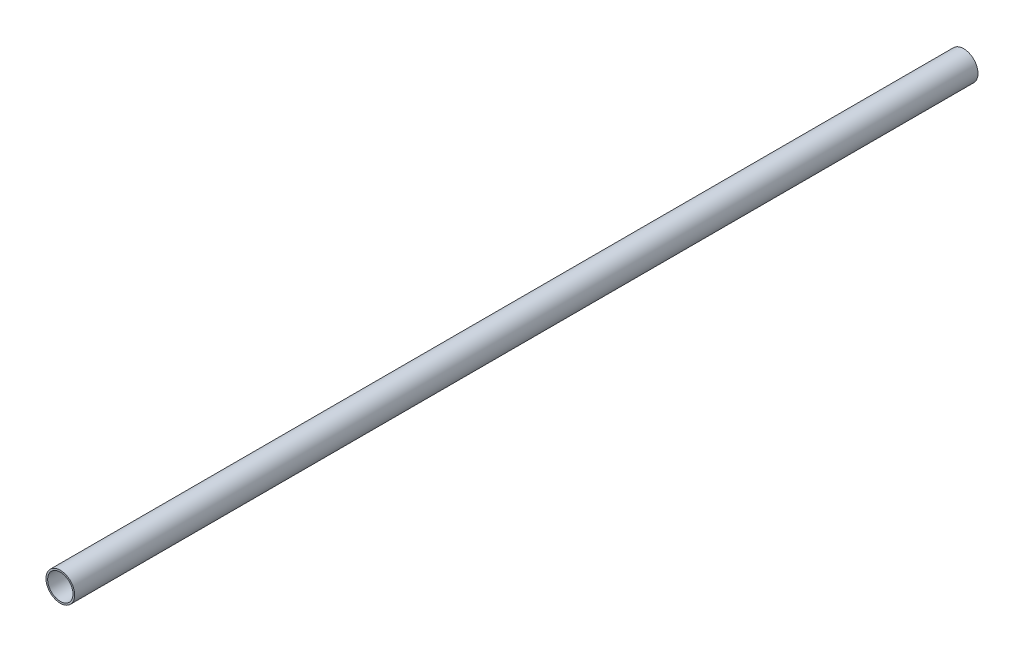
ISO-10303-21;
HEADER;
FILE_DESCRIPTION(('STEP AP214'),'2;1');
FILE_NAME('part.step','',(''),(''),'','','');
FILE_SCHEMA(('AUTOMOTIVE_DESIGN { 1 0 10303 214 1 1 1 1 }'));
ENDSEC;
DATA;
#1=APPLICATION_CONTEXT('core data for automotive mechanical design processes');
#2=APPLICATION_PROTOCOL_DEFINITION('international standard','automotive_design',2000,#1);
#3=PRODUCT_CONTEXT('',#1,'mechanical');
#4=PRODUCT('Part','Part','',(#3));
#5=PRODUCT_RELATED_PRODUCT_CATEGORY('part','',(#4));
#6=PRODUCT_DEFINITION_FORMATION('','',#4);
#7=PRODUCT_DEFINITION_CONTEXT('part definition',#1,'design');
#8=PRODUCT_DEFINITION('design','',#6,#7);
#9=PRODUCT_DEFINITION_SHAPE('','',#8);
#10=(LENGTH_UNIT() NAMED_UNIT(*) SI_UNIT(.MILLI.,.METRE.));
#11=(NAMED_UNIT(*) PLANE_ANGLE_UNIT() SI_UNIT($,.RADIAN.));
#12=(NAMED_UNIT(*) SI_UNIT($,.STERADIAN.) SOLID_ANGLE_UNIT());
#13=UNCERTAINTY_MEASURE_WITH_UNIT(LENGTH_MEASURE(1.E-05),#10,'distance_accuracy_value','');
#14=(GEOMETRIC_REPRESENTATION_CONTEXT(3) GLOBAL_UNCERTAINTY_ASSIGNED_CONTEXT((#13)) GLOBAL_UNIT_ASSIGNED_CONTEXT((#10,
#11,#12)) REPRESENTATION_CONTEXT('',''));
#15=CARTESIAN_POINT('',(0.,0.,0.));
#16=DIRECTION('',(0.,0.,1.));
#17=DIRECTION('',(1.,0.,0.));
#18=AXIS2_PLACEMENT_3D('',#15,#16,#17);
#19=CARTESIAN_POINT('',(0.,0.,800.));
#20=DIRECTION('',(0.,0.,1.));
#21=DIRECTION('',(1.,0.,0.));
#22=AXIS2_PLACEMENT_3D('',#19,#20,#21);
#23=PLANE('',#22);
#24=CARTESIAN_POINT('',(0.,0.,800.));
#25=DIRECTION('',(0.,0.,1.));
#26=DIRECTION('',(1.,0.,0.));
#27=AXIS2_PLACEMENT_3D('',#24,#25,#26);
#28=CIRCLE('',#27,12.7);
#29=CARTESIAN_POINT('',(12.7,0.,800.));
#30=VERTEX_POINT('',#29);
#31=EDGE_CURVE('E10',#30,#30,#28,.T.);
#32=ORIENTED_EDGE('',*,*,#31,.T.);
#33=EDGE_LOOP('',(#32));
#34=FACE_BOUND('',#33,.T.);
#35=CARTESIAN_POINT('',(0.,0.,800.));
#36=DIRECTION('',(0.,0.,1.));
#37=DIRECTION('',(1.,0.,0.));
#38=AXIS2_PLACEMENT_3D('',#35,#36,#37);
#39=CIRCLE('',#38,11.227);
#40=CARTESIAN_POINT('',(11.227,0.,800.));
#41=VERTEX_POINT('',#40);
#42=EDGE_CURVE('E48',#41,#41,#39,.T.);
#43=ORIENTED_EDGE('',*,*,#42,.F.);
#44=EDGE_LOOP('',(#43));
#45=FACE_BOUND('',#44,.T.);
#46=ADVANCED_FACE('F37',(#34,#45),#23,.T.);
#47=CARTESIAN_POINT('',(0.,0.,0.));
#48=DIRECTION('',(0.,0.,1.));
#49=DIRECTION('',(1.,0.,0.));
#50=AXIS2_PLACEMENT_3D('',#47,#48,#49);
#51=PLANE('',#50);
#52=CARTESIAN_POINT('',(0.,0.,0.));
#53=DIRECTION('',(0.,0.,1.));
#54=DIRECTION('',(1.,0.,0.));
#55=AXIS2_PLACEMENT_3D('',#52,#53,#54);
#56=CIRCLE('',#55,12.7);
#57=CARTESIAN_POINT('',(12.7,0.,0.));
#58=VERTEX_POINT('',#57);
#59=EDGE_CURVE('E41',#58,#58,#56,.T.);
#60=ORIENTED_EDGE('',*,*,#59,.F.);
#61=EDGE_LOOP('',(#60));
#62=FACE_BOUND('',#61,.T.);
#63=CARTESIAN_POINT('',(0.,0.,0.));
#64=DIRECTION('',(0.,0.,1.));
#65=DIRECTION('',(1.,0.,0.));
#66=AXIS2_PLACEMENT_3D('',#63,#64,#65);
#67=CIRCLE('',#66,11.227);
#68=CARTESIAN_POINT('',(11.227,0.,0.));
#69=VERTEX_POINT('',#68);
#70=EDGE_CURVE('E50',#69,#69,#67,.T.);
#71=ORIENTED_EDGE('',*,*,#70,.T.);
#72=EDGE_LOOP('',(#71));
#73=FACE_BOUND('',#72,.T.);
#74=ADVANCED_FACE('F60',(#62,#73),#51,.F.);
#75=CARTESIAN_POINT('',(0.,0.,800.));
#76=DIRECTION('',(0.,0.,-1.));
#77=DIRECTION('',(-1.,0.,0.));
#78=AXIS2_PLACEMENT_3D('',#75,#76,#77);
#79=CYLINDRICAL_SURFACE('',#78,12.7);
#80=ORIENTED_EDGE('',*,*,#31,.F.);
#81=EDGE_LOOP('',(#80));
#82=FACE_BOUND('',#81,.T.);
#83=ORIENTED_EDGE('',*,*,#59,.T.);
#84=EDGE_LOOP('',(#83));
#85=FACE_BOUND('',#84,.T.);
#86=ADVANCED_FACE('F39',(#82,#85),#79,.T.);
#87=CARTESIAN_POINT('',(0.,0.,800.));
#88=DIRECTION('',(0.,0.,-1.));
#89=DIRECTION('',(-1.,0.,0.));
#90=AXIS2_PLACEMENT_3D('',#87,#88,#89);
#91=CYLINDRICAL_SURFACE('',#90,11.227);
#92=ORIENTED_EDGE('',*,*,#42,.T.);
#93=EDGE_LOOP('',(#92));
#94=FACE_BOUND('',#93,.T.);
#95=ORIENTED_EDGE('',*,*,#70,.F.);
#96=EDGE_LOOP('',(#95));
#97=FACE_BOUND('',#96,.T.);
#98=ADVANCED_FACE('F56',(#94,#97),#91,.F.);
#99=CLOSED_SHELL('',(#46,#74,#86,#98));
#100=MANIFOLD_SOLID_BREP('B2',#99);
#101=ADVANCED_BREP_SHAPE_REPRESENTATION('',(#18,#100),#14);
#102=SHAPE_DEFINITION_REPRESENTATION(#9,#101);
ENDSEC;
END-ISO-10303-21;
